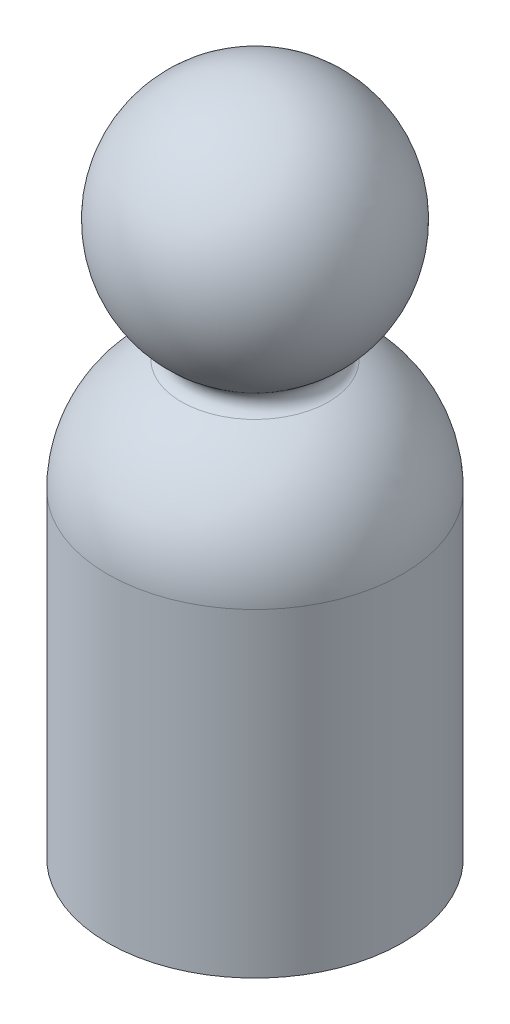
ISO-10303-21;
HEADER;
FILE_DESCRIPTION(('STEP AP214'),'2;1');
FILE_NAME('part.step','',(''),(''),'','','');
FILE_SCHEMA(('AUTOMOTIVE_DESIGN { 1 0 10303 214 1 1 1 1 }'));
ENDSEC;
DATA;
#1=APPLICATION_CONTEXT('core data for automotive mechanical design processes');
#2=APPLICATION_PROTOCOL_DEFINITION('international standard','automotive_design',2000,#1);
#3=PRODUCT_CONTEXT('',#1,'mechanical');
#4=PRODUCT('Part','Part','',(#3));
#5=PRODUCT_RELATED_PRODUCT_CATEGORY('part','',(#4));
#6=PRODUCT_DEFINITION_FORMATION('','',#4);
#7=PRODUCT_DEFINITION_CONTEXT('part definition',#1,'design');
#8=PRODUCT_DEFINITION('design','',#6,#7);
#9=PRODUCT_DEFINITION_SHAPE('','',#8);
#10=(LENGTH_UNIT() NAMED_UNIT(*) SI_UNIT(.MILLI.,.METRE.));
#11=(NAMED_UNIT(*) PLANE_ANGLE_UNIT() SI_UNIT($,.RADIAN.));
#12=(NAMED_UNIT(*) SI_UNIT($,.STERADIAN.) SOLID_ANGLE_UNIT());
#13=UNCERTAINTY_MEASURE_WITH_UNIT(LENGTH_MEASURE(1.E-05),#10,'distance_accuracy_value','');
#14=(GEOMETRIC_REPRESENTATION_CONTEXT(3) GLOBAL_UNCERTAINTY_ASSIGNED_CONTEXT((#13)) GLOBAL_UNIT_ASSIGNED_CONTEXT((#10,
#11,#12)) REPRESENTATION_CONTEXT('',''));
#15=CARTESIAN_POINT('',(0.,0.,0.));
#16=DIRECTION('',(0.,0.,1.));
#17=DIRECTION('',(1.,0.,0.));
#18=AXIS2_PLACEMENT_3D('',#15,#16,#17);
#19=CARTESIAN_POINT('',(0.,0.,0.));
#20=DIRECTION('',(0.,-1.,0.));
#21=DIRECTION('',(1.,0.,0.));
#22=AXIS2_PLACEMENT_3D('',#19,#20,#21);
#23=PLANE('',#22);
#24=CARTESIAN_POINT('',(0.,0.,0.));
#25=DIRECTION('',(0.,-1.,0.));
#26=DIRECTION('',(1.,0.,0.));
#27=AXIS2_PLACEMENT_3D('',#24,#25,#26);
#28=CIRCLE('',#27,12.);
#29=CARTESIAN_POINT('',(12.,0.,0.));
#30=VERTEX_POINT('',#29);
#31=EDGE_CURVE('E10',#30,#30,#28,.T.);
#32=ORIENTED_EDGE('',*,*,#31,.T.);
#33=EDGE_LOOP('',(#32));
#34=FACE_BOUND('',#33,.T.);
#35=ADVANCED_FACE('F34',(#34),#23,.T.);
#36=CARTESIAN_POINT('',(0.,0.,0.));
#37=DIRECTION('',(0.,-1.,0.));
#38=DIRECTION('',(1.,0.,0.));
#39=AXIS2_PLACEMENT_3D('',#36,#37,#38);
#40=CYLINDRICAL_SURFACE('',#39,12.);
#41=CARTESIAN_POINT('',(0.,26.,0.));
#42=DIRECTION('',(0.,-1.,0.));
#43=DIRECTION('',(1.,0.,0.));
#44=AXIS2_PLACEMENT_3D('',#41,#42,#43);
#45=CIRCLE('',#44,12.);
#46=CARTESIAN_POINT('',(12.,26.,0.));
#47=VERTEX_POINT('',#46);
#48=EDGE_CURVE('E41',#47,#47,#45,.T.);
#49=ORIENTED_EDGE('',*,*,#48,.T.);
#50=EDGE_LOOP('',(#49));
#51=FACE_BOUND('',#50,.T.);
#52=ORIENTED_EDGE('',*,*,#31,.F.);
#53=EDGE_LOOP('',(#52));
#54=FACE_BOUND('',#53,.T.);
#55=ADVANCED_FACE('F73',(#51,#54),#40,.T.);
#56=CARTESIAN_POINT('',(0.,26.,0.));
#57=DIRECTION('',(0.,-1.,0.));
#58=DIRECTION('',(1.,0.,0.));
#59=AXIS2_PLACEMENT_3D('',#56,#57,#58);
#60=DEGENERATE_TOROIDAL_SURFACE('',#59,2.,10.,.T.);
#61=CARTESIAN_POINT('',(0.,35.1651513899117,0.));
#62=DIRECTION('',(0.,-1.,0.));
#63=DIRECTION('',(1.,0.,0.));
#64=AXIS2_PLACEMENT_3D('',#61,#62,#63);
#65=CIRCLE('',#64,6.);
#66=CARTESIAN_POINT('',(6.,35.1651513899117,0.));
#67=VERTEX_POINT('',#66);
#68=EDGE_CURVE('E47',#67,#67,#65,.T.);
#69=ORIENTED_EDGE('',*,*,#68,.T.);
#70=EDGE_LOOP('',(#69));
#71=FACE_BOUND('',#70,.T.);
#72=ORIENTED_EDGE('',*,*,#48,.F.);
#73=EDGE_LOOP('',(#72));
#74=FACE_BOUND('',#73,.T.);
#75=ADVANCED_FACE('F70',(#71,#74),#60,.T.);
#76=CARTESIAN_POINT('',(0.,36.0816665289029,0.));
#77=DIRECTION('',(0.,-1.,0.));
#78=DIRECTION('',(1.,0.,0.));
#79=AXIS2_PLACEMENT_3D('',#76,#77,#78);
#80=TOROIDAL_SURFACE('',#79,6.4,1.);
#81=CARTESIAN_POINT('',(0.,36.8949854105881,0.));
#82=DIRECTION('',(0.,-1.,0.));
#83=DIRECTION('',(1.,0.,0.));
#84=AXIS2_PLACEMENT_3D('',#81,#82,#83);
#85=CIRCLE('',#84,5.81818181818182);
#86=CARTESIAN_POINT('',(5.81818181818182,36.8949854105881,0.));
#87=VERTEX_POINT('',#86);
#88=EDGE_CURVE('E53',#87,#87,#85,.T.);
#89=ORIENTED_EDGE('',*,*,#88,.T.);
#90=EDGE_LOOP('',(#89));
#91=FACE_BOUND('',#90,.T.);
#92=ORIENTED_EDGE('',*,*,#68,.F.);
#93=EDGE_LOOP('',(#92));
#94=FACE_BOUND('',#93,.T.);
#95=ADVANCED_FACE('F61',(#91,#94),#80,.F.);
#96=CARTESIAN_POINT('',(0.,45.0281742274409,0.));
#97=DIRECTION('',(0.,-1.,0.));
#98=DIRECTION('',(1.,0.,0.));
#99=AXIS2_PLACEMENT_3D('',#96,#97,#98);
#100=SPHERICAL_SURFACE('',#99,10.);
#101=ORIENTED_EDGE('',*,*,#88,.F.);
#102=EDGE_LOOP('',(#101));
#103=FACE_BOUND('',#102,.T.);
#104=ADVANCED_FACE('F64',(#103),#100,.T.);
#105=CLOSED_SHELL('',(#35,#55,#75,#95,#104));
#106=MANIFOLD_SOLID_BREP('B2',#105);
#107=ADVANCED_BREP_SHAPE_REPRESENTATION('',(#18,#106),#14);
#108=SHAPE_DEFINITION_REPRESENTATION(#9,#107);
ENDSEC;
END-ISO-10303-21;
